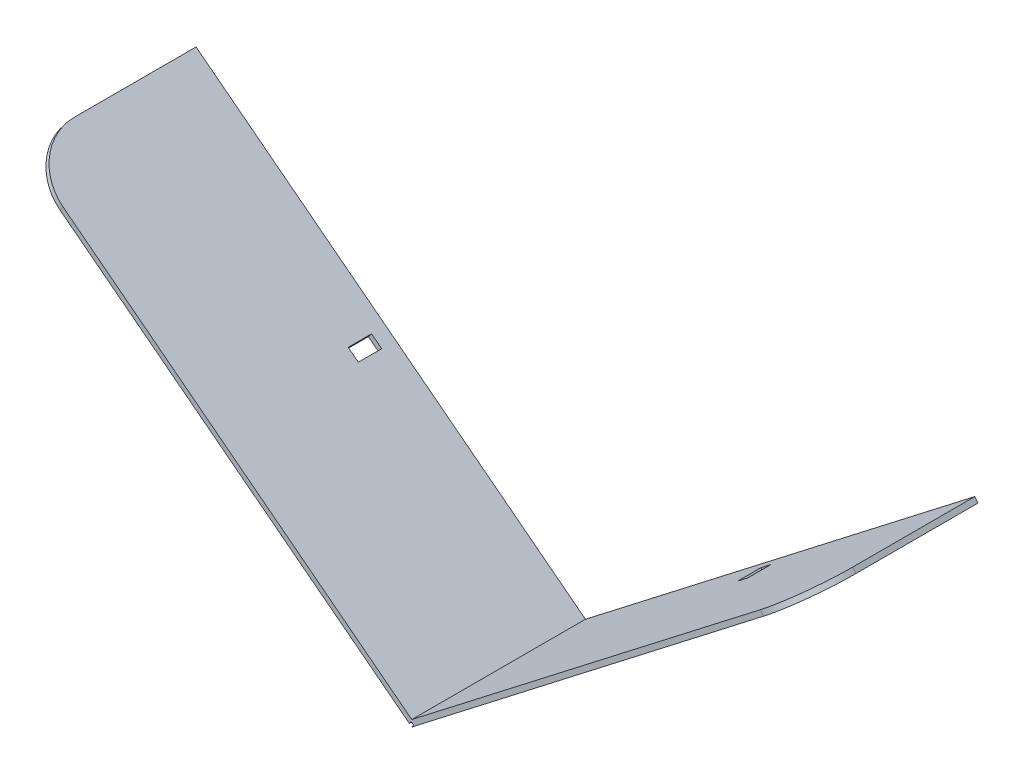
ISO-10303-21;
HEADER;
FILE_DESCRIPTION(('STEP AP214'),'2;1');
FILE_NAME('part.step','',(''),(''),'','','');
FILE_SCHEMA(('AUTOMOTIVE_DESIGN { 1 0 10303 214 1 1 1 1 }'));
ENDSEC;
DATA;
#1=APPLICATION_CONTEXT('core data for automotive mechanical design processes');
#2=APPLICATION_PROTOCOL_DEFINITION('international standard','automotive_design',2000,#1);
#3=PRODUCT_CONTEXT('',#1,'mechanical');
#4=PRODUCT('Part','Part','',(#3));
#5=PRODUCT_RELATED_PRODUCT_CATEGORY('part','',(#4));
#6=PRODUCT_DEFINITION_FORMATION('','',#4);
#7=PRODUCT_DEFINITION_CONTEXT('part definition',#1,'design');
#8=PRODUCT_DEFINITION('design','',#6,#7);
#9=PRODUCT_DEFINITION_SHAPE('','',#8);
#10=(LENGTH_UNIT() NAMED_UNIT(*) SI_UNIT(.MILLI.,.METRE.));
#11=(NAMED_UNIT(*) PLANE_ANGLE_UNIT() SI_UNIT($,.RADIAN.));
#12=(NAMED_UNIT(*) SI_UNIT($,.STERADIAN.) SOLID_ANGLE_UNIT());
#13=UNCERTAINTY_MEASURE_WITH_UNIT(LENGTH_MEASURE(1.E-05),#10,'distance_accuracy_value','');
#14=(GEOMETRIC_REPRESENTATION_CONTEXT(3) GLOBAL_UNCERTAINTY_ASSIGNED_CONTEXT((#13)) GLOBAL_UNIT_ASSIGNED_CONTEXT((#10,
#11,#12)) REPRESENTATION_CONTEXT('',''));
#15=CARTESIAN_POINT('',(0.,0.,0.));
#16=DIRECTION('',(0.,0.,1.));
#17=DIRECTION('',(1.,0.,0.));
#18=AXIS2_PLACEMENT_3D('',#15,#16,#17);
#19=CARTESIAN_POINT('',(0.,0.,-240.2));
#20=DIRECTION('',(-0.611527040185827,-0.791223532967493,0.));
#21=DIRECTION('',(0.791223532967493,-0.611527040185827,0.));
#22=AXIS2_PLACEMENT_3D('',#19,#20,#21);
#23=PLANE('',#22);
#24=DIRECTION('',(0.,0.,1.));
#25=VECTOR('',#24,1.);
#26=CARTESIAN_POINT('',(-186.635563138212,144.248355570605,-240.2));
#27=LINE('',#26,#25);
#28=CARTESIAN_POINT('',(-186.635563138212,144.248355570605,-154.44));
#29=VERTEX_POINT('',#28);
#30=CARTESIAN_POINT('',(-186.635563138212,144.248355570605,-131.84));
#31=VERTEX_POINT('',#30);
#32=EDGE_CURVE('E390',#29,#31,#27,.T.);
#33=ORIENTED_EDGE('',*,*,#32,.F.);
#34=DIRECTION('',(0.791223532967493,-0.611527040185827,0.));
#35=VECTOR('',#34,1.);
#36=CARTESIAN_POINT('',(0.,0.,-154.44));
#37=LINE('',#36,#35);
#38=CARTESIAN_POINT('',(-196.446734947009,151.83129086891,-154.44));
#39=VERTEX_POINT('',#38);
#40=EDGE_CURVE('E376',#39,#29,#37,.T.);
#41=ORIENTED_EDGE('',*,*,#40,.F.);
#42=DIRECTION('',(0.,0.,-1.));
#43=VECTOR('',#42,1.);
#44=CARTESIAN_POINT('',(-196.446734947009,151.83129086891,-240.2));
#45=LINE('',#44,#43);
#46=CARTESIAN_POINT('',(-196.446734947009,151.83129086891,-131.84));
#47=VERTEX_POINT('',#46);
#48=EDGE_CURVE('E385',#47,#39,#45,.T.);
#49=ORIENTED_EDGE('',*,*,#48,.F.);
#50=DIRECTION('',(-0.791223532967493,0.611527040185827,0.));
#51=VECTOR('',#50,1.);
#52=CARTESIAN_POINT('',(0.,0.,-131.84));
#53=LINE('',#52,#51);
#54=EDGE_CURVE('E388',#31,#47,#53,.T.);
#55=ORIENTED_EDGE('',*,*,#54,.F.);
#56=EDGE_LOOP('',(#33,#41,#49,#55));
#57=FACE_BOUND('',#56,.T.);
#58=DIRECTION('',(0.,0.,1.));
#59=VECTOR('',#58,1.);
#60=CARTESIAN_POINT('',(0.,0.,-240.2));
#61=LINE('',#60,#59);
#62=CARTESIAN_POINT('',(0.,0.,-67.256));
#63=VERTEX_POINT('',#62);
#64=CARTESIAN_POINT('',(0.,0.,-33.628));
#65=VERTEX_POINT('',#64);
#66=EDGE_CURVE('E411',#63,#65,#61,.T.);
#67=ORIENTED_EDGE('',*,*,#66,.T.);
#68=DIRECTION('',(-0.791223532967494,0.611527040185827,0.));
#69=VECTOR('',#68,1.);
#70=CARTESIAN_POINT('',(0.,0.,-33.628));
#71=LINE('',#70,#69);
#72=CARTESIAN_POINT('',(-2.37367059890246,1.83458112055752,-33.628));
#73=VERTEX_POINT('',#72);
#74=EDGE_CURVE('E527',#65,#73,#71,.T.);
#75=ORIENTED_EDGE('',*,*,#74,.T.);
#76=DIRECTION('',(0.,0.,-1.));
#77=VECTOR('',#76,1.);
#78=CARTESIAN_POINT('',(-2.37367059890248,1.83458112055744,0.));
#79=LINE('',#78,#77);
#80=CARTESIAN_POINT('',(-2.3736705989025,1.83458112055746,0.));
#81=VERTEX_POINT('',#80);
#82=EDGE_CURVE('E319',#81,#73,#79,.T.);
#83=ORIENTED_EDGE('',*,*,#82,.F.);
#84=DIRECTION('',(0.791223532967493,-0.611527040185827,0.));
#85=VECTOR('',#84,1.);
#86=CARTESIAN_POINT('',(0.,0.,0.));
#87=LINE('',#86,#85);
#88=CARTESIAN_POINT('',(-340.463486235916,263.140085391964,0.));
#89=VERTEX_POINT('',#88);
#90=EDGE_CURVE('E287',#89,#81,#87,.T.);
#91=ORIENTED_EDGE('',*,*,#90,.F.);
#92=CARTESIAN_POINT('',(-340.463486235916,263.140085391964,-50.));
#93=DIRECTION('',(-0.611527040185827,-0.791223532967493,0.));
#94=DIRECTION('',(0.791223532967493,-0.611527040185827,0.));
#95=AXIS2_PLACEMENT_3D('',#92,#93,#94);
#96=CIRCLE('',#95,50.);
#97=CARTESIAN_POINT('',(-380.024662884291,293.716437401255,-50.));
#98=VERTEX_POINT('',#97);
#99=EDGE_CURVE('E460',#89,#98,#96,.T.);
#100=ORIENTED_EDGE('',*,*,#99,.T.);
#101=DIRECTION('',(0.,0.,1.));
#102=VECTOR('',#101,1.);
#103=CARTESIAN_POINT('',(-380.024662884291,293.716437401255,-240.2));
#104=LINE('',#103,#102);
#105=CARTESIAN_POINT('',(-380.024662884291,293.716437401255,-168.14));
#106=VERTEX_POINT('',#105);
#107=EDGE_CURVE('E412',#106,#98,#104,.T.);
#108=ORIENTED_EDGE('',*,*,#107,.F.);
#109=DIRECTION('',(-0.791223532967494,0.611527040185827,0.));
#110=VECTOR('',#109,1.);
#111=CARTESIAN_POINT('',(0.,0.,-168.14));
#112=LINE('',#111,#110);
#113=CARTESIAN_POINT('',(-2.37367059890247,1.83458112055746,-168.14));
#114=VERTEX_POINT('',#113);
#115=EDGE_CURVE('E400',#114,#106,#112,.T.);
#116=ORIENTED_EDGE('',*,*,#115,.F.);
#117=DIRECTION('',(0.,0.,-1.));
#118=VECTOR('',#117,1.);
#119=CARTESIAN_POINT('',(-2.37367059890249,1.83458112055745,0.));
#120=LINE('',#119,#118);
#121=CARTESIAN_POINT('',(-2.37367059890241,1.83458112055751,-134.512));
#122=VERTEX_POINT('',#121);
#123=EDGE_CURVE('E329',#122,#114,#120,.T.);
#124=ORIENTED_EDGE('',*,*,#123,.F.);
#125=DIRECTION('',(-0.791223532967494,0.611527040185827,0.));
#126=VECTOR('',#125,1.);
#127=CARTESIAN_POINT('',(0.,0.,-134.512));
#128=LINE('',#127,#126);
#129=CARTESIAN_POINT('',(0.,0.,-134.512));
#130=VERTEX_POINT('',#129);
#131=EDGE_CURVE('E337',#130,#122,#128,.T.);
#132=ORIENTED_EDGE('',*,*,#131,.F.);
#133=CARTESIAN_POINT('',(0.,0.,-100.884));
#134=VERTEX_POINT('',#133);
#135=EDGE_CURVE('E431',#130,#134,#61,.T.);
#136=ORIENTED_EDGE('',*,*,#135,.T.);
#137=DIRECTION('',(-0.791223532967494,0.611527040185827,0.));
#138=VECTOR('',#137,1.);
#139=CARTESIAN_POINT('',(0.,0.,-100.884));
#140=LINE('',#139,#138);
#141=CARTESIAN_POINT('',(-2.37367059890248,1.83458112055746,-100.884));
#142=VERTEX_POINT('',#141);
#143=EDGE_CURVE('E312',#134,#142,#140,.T.);
#144=ORIENTED_EDGE('',*,*,#143,.T.);
#145=DIRECTION('',(0.,0.,-1.));
#146=VECTOR('',#145,1.);
#147=CARTESIAN_POINT('',(-2.37367059890248,1.83458112055745,0.));
#148=LINE('',#147,#146);
#149=CARTESIAN_POINT('',(-2.37367059890246,1.83458112055746,-67.256));
#150=VERTEX_POINT('',#149);
#151=EDGE_CURVE('E308',#150,#142,#148,.T.);
#152=ORIENTED_EDGE('',*,*,#151,.F.);
#153=DIRECTION('',(-0.791223532967494,0.611527040185827,0.));
#154=VECTOR('',#153,1.);
#155=CARTESIAN_POINT('',(0.,0.,-67.256));
#156=LINE('',#155,#154);
#157=EDGE_CURVE('E102',#63,#150,#156,.T.);
#158=ORIENTED_EDGE('',*,*,#157,.F.);
#159=EDGE_LOOP('',(#67,#75,#83,#91,#100,#108,#116,#124,#132,#136,#144,#152,#158));
#160=FACE_BOUND('',#159,.T.);
#161=ADVANCED_FACE('F87',(#57,#160),#23,.T.);
#162=CARTESIAN_POINT('',(0.,6.31932670309673,-240.2));
#163=DIRECTION('',(-0.611527040185833,0.791223532967489,0.));
#164=DIRECTION('',(-0.791223532967489,-0.611527040185833,0.));
#165=AXIS2_PLACEMENT_3D('',#162,#163,#164);
#166=PLANE('',#165);
#167=DIRECTION('',(-0.791223532967489,-0.611527040185833,0.));
#168=VECTOR('',#167,1.);
#169=CARTESIAN_POINT('',(0.,6.31932670309673,0.));
#170=LINE('',#169,#168);
#171=CARTESIAN_POINT('',(337.405851034982,267.096203056801,0.));
#172=VERTEX_POINT('',#171);
#173=CARTESIAN_POINT('',(0.,6.31932670309673,0.));
#174=VERTEX_POINT('',#173);
#175=EDGE_CURVE('E406',#172,#174,#170,.T.);
#176=ORIENTED_EDGE('',*,*,#175,.F.);
#177=CARTESIAN_POINT('',(337.405851034981,267.096203056801,-50.));
#178=DIRECTION('',(-0.611527040185833,0.791223532967489,0.));
#179=DIRECTION('',(-0.791223532967489,-0.611527040185833,0.));
#180=AXIS2_PLACEMENT_3D('',#177,#178,#179);
#181=CIRCLE('',#180,50.);
#182=CARTESIAN_POINT('',(376.967027683356,297.672555066093,-50.));
#183=VERTEX_POINT('',#182);
#184=EDGE_CURVE('E466',#172,#183,#181,.T.);
#185=ORIENTED_EDGE('',*,*,#184,.T.);
#186=DIRECTION('',(0.,0.,1.));
#187=VECTOR('',#186,1.);
#188=CARTESIAN_POINT('',(376.967027683356,297.672555066093,-240.2));
#189=LINE('',#188,#187);
#190=CARTESIAN_POINT('',(376.967027683356,297.672555066093,-168.14));
#191=VERTEX_POINT('',#190);
#192=EDGE_CURVE('E422',#191,#183,#189,.T.);
#193=ORIENTED_EDGE('',*,*,#192,.F.);
#194=DIRECTION('',(0.791223532967489,0.611527040185833,0.));
#195=VECTOR('',#194,1.);
#196=CARTESIAN_POINT('',(0.,6.31932670309673,-168.14));
#197=LINE('',#196,#195);
#198=CARTESIAN_POINT('',(0.,6.31932670309673,-168.14));
#199=VERTEX_POINT('',#198);
#200=EDGE_CURVE('E394',#199,#191,#197,.T.);
#201=ORIENTED_EDGE('',*,*,#200,.F.);
#202=DIRECTION('',(0.,0.,1.));
#203=VECTOR('',#202,1.);
#204=CARTESIAN_POINT('',(0.,6.31932670309673,-240.2));
#205=LINE('',#204,#203);
#206=EDGE_CURVE('E419',#199,#174,#205,.T.);
#207=ORIENTED_EDGE('',*,*,#206,.T.);
#208=EDGE_LOOP('',(#176,#185,#193,#201,#207));
#209=FACE_BOUND('',#208,.T.);
#210=DIRECTION('',(-0.791223532967489,-0.611527040185833,0.));
#211=VECTOR('',#210,1.);
#212=CARTESIAN_POINT('',(0.,6.31932670309673,-131.84));
#213=LINE('',#212,#211);
#214=CARTESIAN_POINT('',(193.389099746078,155.787408533749,-131.84));
#215=VERTEX_POINT('',#214);
#216=CARTESIAN_POINT('',(183.577927937281,148.204473235444,-131.84));
#217=VERTEX_POINT('',#216);
#218=EDGE_CURVE('E351',#215,#217,#213,.T.);
#219=ORIENTED_EDGE('',*,*,#218,.T.);
#220=DIRECTION('',(0.,0.,-1.));
#221=VECTOR('',#220,1.);
#222=CARTESIAN_POINT('',(183.577927937281,148.204473235444,-240.2));
#223=LINE('',#222,#221);
#224=CARTESIAN_POINT('',(183.577927937281,148.204473235444,-154.44));
#225=VERTEX_POINT('',#224);
#226=EDGE_CURVE('E369',#217,#225,#223,.T.);
#227=ORIENTED_EDGE('',*,*,#226,.T.);
#228=DIRECTION('',(0.791223532967489,0.611527040185833,0.));
#229=VECTOR('',#228,1.);
#230=CARTESIAN_POINT('',(0.,6.31932670309673,-154.44));
#231=LINE('',#230,#229);
#232=CARTESIAN_POINT('',(193.389099746078,155.787408533749,-154.44));
#233=VERTEX_POINT('',#232);
#234=EDGE_CURVE('E366',#225,#233,#231,.T.);
#235=ORIENTED_EDGE('',*,*,#234,.T.);
#236=DIRECTION('',(0.,0.,1.));
#237=VECTOR('',#236,1.);
#238=CARTESIAN_POINT('',(193.389099746078,155.787408533749,-240.2));
#239=LINE('',#238,#237);
#240=EDGE_CURVE('E363',#233,#215,#239,.T.);
#241=ORIENTED_EDGE('',*,*,#240,.T.);
#242=EDGE_LOOP('',(#219,#227,#235,#241));
#243=FACE_BOUND('',#242,.T.);
#244=ADVANCED_FACE('F484',(#209,#243),#166,.T.);
#245=CARTESIAN_POINT('',(0.,0.,-240.2));
#246=DIRECTION('',(0.611527040185833,-0.791223532967489,0.));
#247=DIRECTION('',(0.791223532967489,0.611527040185833,0.));
#248=AXIS2_PLACEMENT_3D('',#245,#246,#247);
#249=PLANE('',#248);
#250=DIRECTION('',(0.,0.,1.));
#251=VECTOR('',#250,1.);
#252=CARTESIAN_POINT('',(380.024662884285,293.716437401255,-240.2));
#253=LINE('',#252,#251);
#254=CARTESIAN_POINT('',(380.024662884285,293.716437401255,-168.14));
#255=VERTEX_POINT('',#254);
#256=CARTESIAN_POINT('',(380.024662884285,293.716437401255,-50.));
#257=VERTEX_POINT('',#256);
#258=EDGE_CURVE('E425',#255,#257,#253,.T.);
#259=ORIENTED_EDGE('',*,*,#258,.T.);
#260=CARTESIAN_POINT('',(340.463486235911,263.140085391964,-50.));
#261=DIRECTION('',(0.611527040185833,-0.791223532967489,0.));
#262=DIRECTION('',(0.791223532967489,0.611527040185833,0.));
#263=AXIS2_PLACEMENT_3D('',#260,#261,#262);
#264=CIRCLE('',#263,50.);
#265=CARTESIAN_POINT('',(340.463486235911,263.140085391964,0.));
#266=VERTEX_POINT('',#265);
#267=EDGE_CURVE('E12',#257,#266,#264,.T.);
#268=ORIENTED_EDGE('',*,*,#267,.T.);
#269=DIRECTION('',(0.791223532967489,0.611527040185833,0.));
#270=VECTOR('',#269,1.);
#271=CARTESIAN_POINT('',(0.,0.,0.));
#272=LINE('',#271,#270);
#273=CARTESIAN_POINT('',(0.,0.,0.));
#274=VERTEX_POINT('',#273);
#275=EDGE_CURVE('E403',#274,#266,#272,.T.);
#276=ORIENTED_EDGE('',*,*,#275,.F.);
#277=DIRECTION('',(0.,0.,1.));
#278=VECTOR('',#277,1.);
#279=CARTESIAN_POINT('',(0.,0.,0.));
#280=LINE('',#279,#278);
#281=EDGE_CURVE('E281',#65,#274,#280,.T.);
#282=ORIENTED_EDGE('',*,*,#281,.F.);
#283=ORIENTED_EDGE('',*,*,#66,.F.);
#284=DIRECTION('',(0.,0.,1.));
#285=VECTOR('',#284,1.);
#286=CARTESIAN_POINT('',(0.,0.,0.));
#287=LINE('',#286,#285);
#288=EDGE_CURVE('E298',#134,#63,#287,.T.);
#289=ORIENTED_EDGE('',*,*,#288,.F.);
#290=ORIENTED_EDGE('',*,*,#135,.F.);
#291=CARTESIAN_POINT('',(0.,0.,-168.14));
#292=VERTEX_POINT('',#291);
#293=EDGE_CURVE('E428',#292,#130,#61,.T.);
#294=ORIENTED_EDGE('',*,*,#293,.F.);
#295=DIRECTION('',(-0.791223532967489,-0.611527040185833,0.));
#296=VECTOR('',#295,1.);
#297=CARTESIAN_POINT('',(0.,0.,-168.14));
#298=LINE('',#297,#296);
#299=EDGE_CURVE('E415',#255,#292,#298,.T.);
#300=ORIENTED_EDGE('',*,*,#299,.F.);
#301=EDGE_LOOP('',(#259,#268,#276,#282,#283,#289,#290,#294,#300));
#302=FACE_BOUND('',#301,.T.);
#303=DIRECTION('',(-0.791223532967489,-0.611527040185833,0.));
#304=VECTOR('',#303,1.);
#305=CARTESIAN_POINT('',(0.,0.,-154.44));
#306=LINE('',#305,#304);
#307=CARTESIAN_POINT('',(196.446734947007,151.831290868911,-154.44));
#308=VERTEX_POINT('',#307);
#309=CARTESIAN_POINT('',(186.635563138211,144.248355570607,-154.44));
#310=VERTEX_POINT('',#309);
#311=EDGE_CURVE('E449',#308,#310,#306,.T.);
#312=ORIENTED_EDGE('',*,*,#311,.T.);
#313=DIRECTION('',(0.,0.,1.));
#314=VECTOR('',#313,1.);
#315=CARTESIAN_POINT('',(186.635563138211,144.248355570607,-240.2));
#316=LINE('',#315,#314);
#317=CARTESIAN_POINT('',(186.635563138211,144.248355570607,-131.84));
#318=VERTEX_POINT('',#317);
#319=EDGE_CURVE('E452',#310,#318,#316,.T.);
#320=ORIENTED_EDGE('',*,*,#319,.T.);
#321=DIRECTION('',(0.791223532967489,0.611527040185833,0.));
#322=VECTOR('',#321,1.);
#323=CARTESIAN_POINT('',(0.,0.,-131.84));
#324=LINE('',#323,#322);
#325=CARTESIAN_POINT('',(196.446734947007,151.831290868911,-131.84));
#326=VERTEX_POINT('',#325);
#327=EDGE_CURVE('E443',#318,#326,#324,.T.);
#328=ORIENTED_EDGE('',*,*,#327,.T.);
#329=DIRECTION('',(0.,0.,-1.));
#330=VECTOR('',#329,1.);
#331=CARTESIAN_POINT('',(196.446734947007,151.831290868911,-240.2));
#332=LINE('',#331,#330);
#333=EDGE_CURVE('E446',#326,#308,#332,.T.);
#334=ORIENTED_EDGE('',*,*,#333,.T.);
#335=EDGE_LOOP('',(#312,#320,#328,#334));
#336=FACE_BOUND('',#335,.T.);
#337=ADVANCED_FACE('F477',(#302,#336),#249,.T.);
#338=CARTESIAN_POINT('',(-380.024662884291,293.716437401255,-240.2));
#339=DIRECTION('',(-0.791223532967494,0.611527040185826,0.));
#340=DIRECTION('',(-0.611527040185826,-0.791223532967494,0.));
#341=AXIS2_PLACEMENT_3D('',#338,#339,#340);
#342=PLANE('',#341);
#343=ORIENTED_EDGE('',*,*,#107,.T.);
#344=DIRECTION('',(-0.611527040185826,-0.791223532967494,0.));
#345=VECTOR('',#344,1.);
#346=CARTESIAN_POINT('',(-376.967027683362,297.672555066093,-50.));
#347=LINE('',#346,#345);
#348=CARTESIAN_POINT('',(-376.967027683362,297.672555066093,-50.));
#349=VERTEX_POINT('',#348);
#350=EDGE_CURVE('E462',#98,#349,#347,.F.);
#351=ORIENTED_EDGE('',*,*,#350,.T.);
#352=DIRECTION('',(0.,0.,1.));
#353=VECTOR('',#352,1.);
#354=CARTESIAN_POINT('',(-376.967027683362,297.672555066093,-240.2));
#355=LINE('',#354,#353);
#356=CARTESIAN_POINT('',(-376.967027683362,297.672555066093,-168.14));
#357=VERTEX_POINT('',#356);
#358=EDGE_CURVE('E416',#357,#349,#355,.T.);
#359=ORIENTED_EDGE('',*,*,#358,.F.);
#360=DIRECTION('',(0.611527040185826,0.791223532967494,0.));
#361=VECTOR('',#360,1.);
#362=CARTESIAN_POINT('',(-380.024662884291,293.716437401255,-168.14));
#363=LINE('',#362,#361);
#364=EDGE_CURVE('E398',#106,#357,#363,.T.);
#365=ORIENTED_EDGE('',*,*,#364,.F.);
#366=EDGE_LOOP('',(#343,#351,#359,#365));
#367=FACE_BOUND('',#366,.T.);
#368=ADVANCED_FACE('F503',(#367),#342,.T.);
#369=CARTESIAN_POINT('',(0.,6.31932670309673,-240.2));
#370=DIRECTION('',(0.611527040185827,0.791223532967494,0.));
#371=DIRECTION('',(-0.791223532967494,0.611527040185827,0.));
#372=AXIS2_PLACEMENT_3D('',#369,#370,#371);
#373=PLANE('',#372);
#374=DIRECTION('',(0.,0.,-1.));
#375=VECTOR('',#374,1.);
#376=CARTESIAN_POINT('',(-183.577927937283,148.204473235443,-240.2));
#377=LINE('',#376,#375);
#378=CARTESIAN_POINT('',(-183.577927937283,148.204473235443,-131.84));
#379=VERTEX_POINT('',#378);
#380=CARTESIAN_POINT('',(-183.577927937283,148.204473235443,-154.44));
#381=VERTEX_POINT('',#380);
#382=EDGE_CURVE('E440',#379,#381,#377,.T.);
#383=ORIENTED_EDGE('',*,*,#382,.F.);
#384=DIRECTION('',(0.791223532967494,-0.611527040185827,0.));
#385=VECTOR('',#384,1.);
#386=CARTESIAN_POINT('',(0.,6.31932670309673,-131.84));
#387=LINE('',#386,#385);
#388=CARTESIAN_POINT('',(-193.389099746079,155.787408533747,-131.84));
#389=VERTEX_POINT('',#388);
#390=EDGE_CURVE('E438',#389,#379,#387,.T.);
#391=ORIENTED_EDGE('',*,*,#390,.F.);
#392=DIRECTION('',(0.,0.,1.));
#393=VECTOR('',#392,1.);
#394=CARTESIAN_POINT('',(-193.389099746079,155.787408533747,-240.2));
#395=LINE('',#394,#393);
#396=CARTESIAN_POINT('',(-193.389099746079,155.787408533747,-154.44));
#397=VERTEX_POINT('',#396);
#398=EDGE_CURVE('E436',#397,#389,#395,.T.);
#399=ORIENTED_EDGE('',*,*,#398,.F.);
#400=DIRECTION('',(-0.791223532967494,0.611527040185827,0.));
#401=VECTOR('',#400,1.);
#402=CARTESIAN_POINT('',(0.,6.31932670309673,-154.44));
#403=LINE('',#402,#401);
#404=EDGE_CURVE('E434',#381,#397,#403,.T.);
#405=ORIENTED_EDGE('',*,*,#404,.F.);
#406=EDGE_LOOP('',(#383,#391,#399,#405));
#407=FACE_BOUND('',#406,.T.);
#408=ORIENTED_EDGE('',*,*,#358,.T.);
#409=CARTESIAN_POINT('',(-337.405851034987,267.096203056802,-50.));
#410=DIRECTION('',(0.611527040185827,0.791223532967494,0.));
#411=DIRECTION('',(-0.791223532967494,0.611527040185827,0.));
#412=AXIS2_PLACEMENT_3D('',#409,#410,#411);
#413=CIRCLE('',#412,50.);
#414=CARTESIAN_POINT('',(-337.405851034987,267.096203056802,0.));
#415=VERTEX_POINT('',#414);
#416=EDGE_CURVE('E464',#349,#415,#413,.T.);
#417=ORIENTED_EDGE('',*,*,#416,.T.);
#418=DIRECTION('',(-0.791223532967493,0.611527040185827,0.));
#419=VECTOR('',#418,1.);
#420=CARTESIAN_POINT('',(0.,6.31932670309673,0.));
#421=LINE('',#420,#419);
#422=EDGE_CURVE('E408',#174,#415,#421,.T.);
#423=ORIENTED_EDGE('',*,*,#422,.F.);
#424=ORIENTED_EDGE('',*,*,#206,.F.);
#425=DIRECTION('',(0.791223532967494,-0.611527040185827,0.));
#426=VECTOR('',#425,1.);
#427=CARTESIAN_POINT('',(0.,6.31932670309672,-168.14));
#428=LINE('',#427,#426);
#429=EDGE_CURVE('E396',#357,#199,#428,.T.);
#430=ORIENTED_EDGE('',*,*,#429,.F.);
#431=EDGE_LOOP('',(#408,#417,#423,#424,#430));
#432=FACE_BOUND('',#431,.T.);
#433=ADVANCED_FACE('F491',(#407,#432),#373,.T.);
#434=CARTESIAN_POINT('',(380.024662884285,293.716437401255,-240.2));
#435=DIRECTION('',(0.791223532967503,0.611527040185814,0.));
#436=DIRECTION('',(-0.611527040185814,0.791223532967504,0.));
#437=AXIS2_PLACEMENT_3D('',#434,#435,#436);
#438=PLANE('',#437);
#439=ORIENTED_EDGE('',*,*,#192,.T.);
#440=DIRECTION('',(-0.611527040185814,0.791223532967504,0.));
#441=VECTOR('',#440,1.);
#442=CARTESIAN_POINT('',(380.024662884285,293.716437401255,-50.));
#443=LINE('',#442,#441);
#444=EDGE_CURVE('E95',#183,#257,#443,.F.);
#445=ORIENTED_EDGE('',*,*,#444,.T.);
#446=ORIENTED_EDGE('',*,*,#258,.F.);
#447=DIRECTION('',(0.611527040185814,-0.791223532967504,0.));
#448=VECTOR('',#447,1.);
#449=CARTESIAN_POINT('',(380.024662884285,293.716437401255,-168.14));
#450=LINE('',#449,#448);
#451=EDGE_CURVE('E392',#191,#255,#450,.T.);
#452=ORIENTED_EDGE('',*,*,#451,.F.);
#453=EDGE_LOOP('',(#439,#445,#446,#452));
#454=FACE_BOUND('',#453,.T.);
#455=ADVANCED_FACE('F470',(#454),#438,.T.);
#456=CARTESIAN_POINT('',(0.,0.,0.));
#457=DIRECTION('',(0.,0.,-1.));
#458=DIRECTION('',(-1.,0.,0.));
#459=AXIS2_PLACEMENT_3D('',#456,#457,#458);
#460=PLANE('',#459);
#461=DIRECTION('',(-0.791223532967494,0.611527040185827,0.));
#462=VECTOR('',#461,1.);
#463=CARTESIAN_POINT('',(1.83458112055746,2.37367059890246,0.));
#464=LINE('',#463,#462);
#465=CARTESIAN_POINT('',(1.83458112055747,2.37367059890246,0.));
#466=VERTEX_POINT('',#465);
#467=CARTESIAN_POINT('',(-0.539089478345022,4.20825171945995,0.));
#468=VERTEX_POINT('',#467);
#469=EDGE_CURVE('E275',#466,#468,#464,.T.);
#470=ORIENTED_EDGE('',*,*,#469,.F.);
#471=DIRECTION('',(-0.611527040185827,-0.791223532967493,0.));
#472=VECTOR('',#471,1.);
#473=CARTESIAN_POINT('',(1.83458112055746,2.37367059890246,0.));
#474=LINE('',#473,#472);
#475=EDGE_CURVE('E360',#466,#274,#474,.T.);
#476=ORIENTED_EDGE('',*,*,#475,.T.);
#477=ORIENTED_EDGE('',*,*,#275,.T.);
#478=DIRECTION('',(-0.611527040185814,0.791223532967504,0.));
#479=VECTOR('',#478,1.);
#480=CARTESIAN_POINT('',(337.405851034981,267.096203056802,0.));
#481=LINE('',#480,#479);
#482=EDGE_CURVE('E455',#266,#172,#481,.T.);
#483=ORIENTED_EDGE('',*,*,#482,.T.);
#484=ORIENTED_EDGE('',*,*,#175,.T.);
#485=ORIENTED_EDGE('',*,*,#422,.T.);
#486=DIRECTION('',(-0.611527040185826,-0.791223532967494,0.));
#487=VECTOR('',#486,1.);
#488=CARTESIAN_POINT('',(-340.463486235916,263.140085391964,0.));
#489=LINE('',#488,#487);
#490=EDGE_CURVE('E458',#415,#89,#489,.T.);
#491=ORIENTED_EDGE('',*,*,#490,.T.);
#492=ORIENTED_EDGE('',*,*,#90,.T.);
#493=DIRECTION('',(-0.611527040185827,-0.791223532967493,0.));
#494=VECTOR('',#493,1.);
#495=CARTESIAN_POINT('',(-0.539089478345022,4.20825171945995,0.));
#496=LINE('',#495,#494);
#497=EDGE_CURVE('E271',#468,#81,#496,.T.);
#498=ORIENTED_EDGE('',*,*,#497,.F.);
#499=EDGE_LOOP('',(#470,#476,#477,#483,#484,#485,#491,#492,#498));
#500=FACE_BOUND('',#499,.T.);
#501=ADVANCED_FACE('F284',(#500),#460,.F.);
#502=CARTESIAN_POINT('',(0.,297.672555066093,-168.14));
#503=DIRECTION('',(0.,0.,1.));
#504=DIRECTION('',(1.,0.,0.));
#505=AXIS2_PLACEMENT_3D('',#502,#503,#504);
#506=PLANE('',#505);
#507=ORIENTED_EDGE('',*,*,#299,.T.);
#508=DIRECTION('',(-0.611527040185827,-0.791223532967493,0.));
#509=VECTOR('',#508,1.);
#510=CARTESIAN_POINT('',(1.83458112055748,2.37367059890248,-168.14));
#511=LINE('',#510,#509);
#512=CARTESIAN_POINT('',(1.83458112055748,2.37367059890248,-168.14));
#513=VERTEX_POINT('',#512);
#514=EDGE_CURVE('E342',#513,#292,#511,.T.);
#515=ORIENTED_EDGE('',*,*,#514,.F.);
#516=DIRECTION('',(0.791223532967494,-0.611527040185827,0.));
#517=VECTOR('',#516,1.);
#518=CARTESIAN_POINT('',(1.83458112055746,2.37367059890249,-168.14));
#519=LINE('',#518,#517);
#520=CARTESIAN_POINT('',(-0.539089478344995,4.20825171945999,-168.14));
#521=VERTEX_POINT('',#520);
#522=EDGE_CURVE('E331',#521,#513,#519,.T.);
#523=ORIENTED_EDGE('',*,*,#522,.F.);
#524=DIRECTION('',(-0.611527040185827,-0.791223532967493,0.));
#525=VECTOR('',#524,1.);
#526=CARTESIAN_POINT('',(-0.539089478344991,4.20825171945994,-168.14));
#527=LINE('',#526,#525);
#528=EDGE_CURVE('E344',#521,#114,#527,.T.);
#529=ORIENTED_EDGE('',*,*,#528,.T.);
#530=ORIENTED_EDGE('',*,*,#115,.T.);
#531=ORIENTED_EDGE('',*,*,#364,.T.);
#532=ORIENTED_EDGE('',*,*,#429,.T.);
#533=ORIENTED_EDGE('',*,*,#200,.T.);
#534=ORIENTED_EDGE('',*,*,#451,.T.);
#535=EDGE_LOOP('',(#507,#515,#523,#529,#530,#531,#532,#533,#534));
#536=FACE_BOUND('',#535,.T.);
#537=ADVANCED_FACE('F506',(#536),#506,.F.);
#538=CARTESIAN_POINT('',(-328.751608135456,-39.6283200706181,-131.84));
#539=DIRECTION('',(0.791223532967493,-0.611527040185827,0.));
#540=DIRECTION('',(0.611527040185827,0.791223532967493,0.));
#541=AXIS2_PLACEMENT_3D('',#538,#539,#540);
#542=PLANE('',#541);
#543=ORIENTED_EDGE('',*,*,#32,.T.);
#544=DIRECTION('',(0.611527040185827,0.791223532967493,0.));
#545=VECTOR('',#544,1.);
#546=CARTESIAN_POINT('',(-328.751608135456,-39.6283200706181,-131.84));
#547=LINE('',#546,#545);
#548=EDGE_CURVE('E373',#31,#379,#547,.T.);
#549=ORIENTED_EDGE('',*,*,#548,.T.);
#550=ORIENTED_EDGE('',*,*,#382,.T.);
#551=DIRECTION('',(0.611527040185827,0.791223532967493,0.));
#552=VECTOR('',#551,1.);
#553=CARTESIAN_POINT('',(-328.751608135456,-39.6283200706181,-154.44));
#554=LINE('',#553,#552);
#555=EDGE_CURVE('E372',#29,#381,#554,.T.);
#556=ORIENTED_EDGE('',*,*,#555,.F.);
#557=EDGE_LOOP('',(#543,#549,#550,#556));
#558=FACE_BOUND('',#557,.T.);
#559=ADVANCED_FACE('F584',(#558),#542,.F.);
#560=CARTESIAN_POINT('',(-338.562779944253,-32.0453847723139,-131.84));
#561=DIRECTION('',(0.,0.,1.));
#562=DIRECTION('',(1.,0.,0.));
#563=AXIS2_PLACEMENT_3D('',#560,#561,#562);
#564=PLANE('',#563);
#565=ORIENTED_EDGE('',*,*,#54,.T.);
#566=DIRECTION('',(0.611527040185827,0.791223532967493,0.));
#567=VECTOR('',#566,1.);
#568=CARTESIAN_POINT('',(-338.562779944253,-32.0453847723139,-131.84));
#569=LINE('',#568,#567);
#570=EDGE_CURVE('E377',#47,#389,#569,.T.);
#571=ORIENTED_EDGE('',*,*,#570,.T.);
#572=ORIENTED_EDGE('',*,*,#390,.T.);
#573=ORIENTED_EDGE('',*,*,#548,.F.);
#574=EDGE_LOOP('',(#565,#571,#572,#573));
#575=FACE_BOUND('',#574,.T.);
#576=ADVANCED_FACE('F580',(#575),#564,.F.);
#577=CARTESIAN_POINT('',(-338.562779944253,-32.0453847723139,-131.84));
#578=DIRECTION('',(-0.791223532967493,0.611527040185827,0.));
#579=DIRECTION('',(-0.611527040185827,-0.791223532967493,0.));
#580=AXIS2_PLACEMENT_3D('',#577,#578,#579);
#581=PLANE('',#580);
#582=ORIENTED_EDGE('',*,*,#48,.T.);
#583=DIRECTION('',(0.611527040185827,0.791223532967493,0.));
#584=VECTOR('',#583,1.);
#585=CARTESIAN_POINT('',(-338.562779944253,-32.0453847723139,-154.44));
#586=LINE('',#585,#584);
#587=EDGE_CURVE('E380',#39,#397,#586,.T.);
#588=ORIENTED_EDGE('',*,*,#587,.T.);
#589=ORIENTED_EDGE('',*,*,#398,.T.);
#590=ORIENTED_EDGE('',*,*,#570,.F.);
#591=EDGE_LOOP('',(#582,#588,#589,#590));
#592=FACE_BOUND('',#591,.T.);
#593=ADVANCED_FACE('F583',(#592),#581,.F.);
#594=CARTESIAN_POINT('',(-338.562779944253,-32.0453847723139,-154.44));
#595=DIRECTION('',(0.,0.,-1.));
#596=DIRECTION('',(-1.,0.,0.));
#597=AXIS2_PLACEMENT_3D('',#594,#595,#596);
#598=PLANE('',#597);
#599=ORIENTED_EDGE('',*,*,#40,.T.);
#600=ORIENTED_EDGE('',*,*,#555,.T.);
#601=ORIENTED_EDGE('',*,*,#404,.T.);
#602=ORIENTED_EDGE('',*,*,#587,.F.);
#603=EDGE_LOOP('',(#599,#600,#601,#602));
#604=FACE_BOUND('',#603,.T.);
#605=ADVANCED_FACE('F578',(#604),#598,.F.);
#606=CARTESIAN_POINT('',(328.751608135453,-39.6283200706153,-131.84));
#607=DIRECTION('',(0.791223532967493,0.611527040185827,0.));
#608=DIRECTION('',(-0.611527040185827,0.791223532967493,0.));
#609=AXIS2_PLACEMENT_3D('',#606,#607,#608);
#610=PLANE('',#609);
#611=DIRECTION('',(-0.611527040185827,0.791223532967493,0.));
#612=VECTOR('',#611,1.);
#613=CARTESIAN_POINT('',(328.751608135453,-39.6283200706153,-131.84));
#614=LINE('',#613,#612);
#615=EDGE_CURVE('E358',#318,#217,#614,.T.);
#616=ORIENTED_EDGE('',*,*,#615,.F.);
#617=ORIENTED_EDGE('',*,*,#319,.F.);
#618=DIRECTION('',(-0.611527040185827,0.791223532967493,0.));
#619=VECTOR('',#618,1.);
#620=CARTESIAN_POINT('',(328.751608135453,-39.6283200706153,-154.44));
#621=LINE('',#620,#619);
#622=EDGE_CURVE('E348',#310,#225,#621,.T.);
#623=ORIENTED_EDGE('',*,*,#622,.T.);
#624=ORIENTED_EDGE('',*,*,#226,.F.);
#625=EDGE_LOOP('',(#616,#617,#623,#624));
#626=FACE_BOUND('',#625,.T.);
#627=ADVANCED_FACE('F575',(#626),#610,.T.);
#628=CARTESIAN_POINT('',(338.56277994425,-32.0453847723111,-154.44));
#629=DIRECTION('',(0.,0.,1.));
#630=DIRECTION('',(1.,0.,0.));
#631=AXIS2_PLACEMENT_3D('',#628,#629,#630);
#632=PLANE('',#631);
#633=ORIENTED_EDGE('',*,*,#622,.F.);
#634=ORIENTED_EDGE('',*,*,#311,.F.);
#635=DIRECTION('',(-0.611527040185827,0.791223532967493,0.));
#636=VECTOR('',#635,1.);
#637=CARTESIAN_POINT('',(338.56277994425,-32.0453847723111,-154.44));
#638=LINE('',#637,#636);
#639=EDGE_CURVE('E352',#308,#233,#638,.T.);
#640=ORIENTED_EDGE('',*,*,#639,.T.);
#641=ORIENTED_EDGE('',*,*,#234,.F.);
#642=EDGE_LOOP('',(#633,#634,#640,#641));
#643=FACE_BOUND('',#642,.T.);
#644=ADVANCED_FACE('F570',(#643),#632,.T.);
#645=CARTESIAN_POINT('',(338.56277994425,-32.0453847723111,-131.84));
#646=DIRECTION('',(-0.791223532967493,-0.611527040185827,0.));
#647=DIRECTION('',(0.611527040185827,-0.791223532967493,0.));
#648=AXIS2_PLACEMENT_3D('',#645,#646,#647);
#649=PLANE('',#648);
#650=ORIENTED_EDGE('',*,*,#639,.F.);
#651=ORIENTED_EDGE('',*,*,#333,.F.);
#652=DIRECTION('',(-0.611527040185827,0.791223532967493,0.));
#653=VECTOR('',#652,1.);
#654=CARTESIAN_POINT('',(338.56277994425,-32.0453847723111,-131.84));
#655=LINE('',#654,#653);
#656=EDGE_CURVE('E355',#326,#215,#655,.T.);
#657=ORIENTED_EDGE('',*,*,#656,.T.);
#658=ORIENTED_EDGE('',*,*,#240,.F.);
#659=EDGE_LOOP('',(#650,#651,#657,#658));
#660=FACE_BOUND('',#659,.T.);
#661=ADVANCED_FACE('F564',(#660),#649,.T.);
#662=CARTESIAN_POINT('',(338.56277994425,-32.0453847723111,-131.84));
#663=DIRECTION('',(0.,0.,-1.));
#664=DIRECTION('',(-1.,0.,0.));
#665=AXIS2_PLACEMENT_3D('',#662,#663,#664);
#666=PLANE('',#665);
#667=ORIENTED_EDGE('',*,*,#656,.F.);
#668=ORIENTED_EDGE('',*,*,#327,.F.);
#669=ORIENTED_EDGE('',*,*,#615,.T.);
#670=ORIENTED_EDGE('',*,*,#218,.F.);
#671=EDGE_LOOP('',(#667,#668,#669,#670));
#672=FACE_BOUND('',#671,.T.);
#673=ADVANCED_FACE('F559',(#672),#666,.T.);
#674=CARTESIAN_POINT('',(-340.463486235916,263.140085391964,-50.));
#675=DIRECTION('',(0.611527040185826,0.791223532967494,0.));
#676=DIRECTION('',(-0.791223532967494,0.611527040185826,0.));
#677=AXIS2_PLACEMENT_3D('',#674,#675,#676);
#678=CYLINDRICAL_SURFACE('',#677,50.);
#679=ORIENTED_EDGE('',*,*,#416,.F.);
#680=ORIENTED_EDGE('',*,*,#350,.F.);
#681=ORIENTED_EDGE('',*,*,#99,.F.);
#682=ORIENTED_EDGE('',*,*,#490,.F.);
#683=EDGE_LOOP('',(#679,#680,#681,#682));
#684=FACE_BOUND('',#683,.T.);
#685=ADVANCED_FACE('F495',(#684),#678,.T.);
#686=CARTESIAN_POINT('',(340.463486235917,263.140085391956,-50.));
#687=DIRECTION('',(0.611527040185814,-0.791223532967504,0.));
#688=DIRECTION('',(0.791223532967504,0.611527040185814,0.));
#689=AXIS2_PLACEMENT_3D('',#686,#687,#688);
#690=CYLINDRICAL_SURFACE('',#689,50.);
#691=ORIENTED_EDGE('',*,*,#267,.F.);
#692=ORIENTED_EDGE('',*,*,#444,.F.);
#693=ORIENTED_EDGE('',*,*,#184,.F.);
#694=ORIENTED_EDGE('',*,*,#482,.F.);
#695=EDGE_LOOP('',(#691,#692,#693,#694));
#696=FACE_BOUND('',#695,.T.);
#697=ADVANCED_FACE('F89',(#696),#690,.T.);
#698=CARTESIAN_POINT('',(1.83458112055747,2.37367059890247,-134.512));
#699=DIRECTION('',(0.,0.,1.));
#700=DIRECTION('',(1.,0.,0.));
#701=AXIS2_PLACEMENT_3D('',#698,#699,#700);
#702=PLANE('',#701);
#703=ORIENTED_EDGE('',*,*,#131,.T.);
#704=DIRECTION('',(-0.611527040185827,-0.791223532967493,0.));
#705=VECTOR('',#704,1.);
#706=CARTESIAN_POINT('',(-0.539089478344932,4.20825171945999,-134.512));
#707=LINE('',#706,#705);
#708=CARTESIAN_POINT('',(-0.539089478344932,4.20825171945999,-134.512));
#709=VERTEX_POINT('',#708);
#710=EDGE_CURVE('E336',#709,#122,#707,.T.);
#711=ORIENTED_EDGE('',*,*,#710,.F.);
#712=DIRECTION('',(-0.791223532967494,0.611527040185827,0.));
#713=VECTOR('',#712,1.);
#714=CARTESIAN_POINT('',(1.83458112055747,2.37367059890247,-134.512));
#715=LINE('',#714,#713);
#716=CARTESIAN_POINT('',(1.83458112055747,2.37367059890247,-134.512));
#717=VERTEX_POINT('',#716);
#718=EDGE_CURVE('E325',#717,#709,#715,.T.);
#719=ORIENTED_EDGE('',*,*,#718,.F.);
#720=DIRECTION('',(-0.611527040185827,-0.791223532967493,0.));
#721=VECTOR('',#720,1.);
#722=CARTESIAN_POINT('',(1.83458112055747,2.37367059890247,-134.512));
#723=LINE('',#722,#721);
#724=EDGE_CURVE('E309',#717,#130,#723,.T.);
#725=ORIENTED_EDGE('',*,*,#724,.T.);
#726=EDGE_LOOP('',(#703,#711,#719,#725));
#727=FACE_BOUND('',#726,.T.);
#728=ADVANCED_FACE('F518',(#727),#702,.F.);
#729=CARTESIAN_POINT('',(1.83458112055746,2.37367059890246,0.));
#730=DIRECTION('',(0.791223532967493,-0.611527040185827,0.));
#731=DIRECTION('',(0.611527040185827,0.791223532967494,0.));
#732=AXIS2_PLACEMENT_3D('',#729,#730,#731);
#733=PLANE('',#732);
#734=ORIENTED_EDGE('',*,*,#293,.T.);
#735=ORIENTED_EDGE('',*,*,#724,.F.);
#736=DIRECTION('',(0.,0.,1.));
#737=VECTOR('',#736,1.);
#738=CARTESIAN_POINT('',(1.83458112055746,2.37367059890246,0.));
#739=LINE('',#738,#737);
#740=EDGE_CURVE('E333',#513,#717,#739,.T.);
#741=ORIENTED_EDGE('',*,*,#740,.F.);
#742=ORIENTED_EDGE('',*,*,#514,.T.);
#743=EDGE_LOOP('',(#734,#735,#741,#742));
#744=FACE_BOUND('',#743,.T.);
#745=ADVANCED_FACE('F521',(#744),#733,.F.);
#746=CARTESIAN_POINT('',(-0.539089478345008,4.20825171945993,0.));
#747=DIRECTION('',(-0.791223532967493,0.611527040185827,0.));
#748=DIRECTION('',(-0.611527040185827,-0.791223532967494,0.));
#749=AXIS2_PLACEMENT_3D('',#746,#747,#748);
#750=PLANE('',#749);
#751=ORIENTED_EDGE('',*,*,#123,.T.);
#752=ORIENTED_EDGE('',*,*,#528,.F.);
#753=DIRECTION('',(0.,0.,-1.));
#754=VECTOR('',#753,1.);
#755=CARTESIAN_POINT('',(-0.539089478345008,4.20825171945993,0.));
#756=LINE('',#755,#754);
#757=EDGE_CURVE('E328',#709,#521,#756,.T.);
#758=ORIENTED_EDGE('',*,*,#757,.F.);
#759=ORIENTED_EDGE('',*,*,#710,.T.);
#760=EDGE_LOOP('',(#751,#752,#758,#759));
#761=FACE_BOUND('',#760,.T.);
#762=ADVANCED_FACE('F514',(#761),#750,.F.);
#763=CARTESIAN_POINT('',(1.83458112055746,2.37367059890246,0.));
#764=DIRECTION('',(-0.611527040185827,-0.791223532967493,0.));
#765=DIRECTION('',(0.791223532967494,-0.611527040185827,0.));
#766=AXIS2_PLACEMENT_3D('',#763,#764,#765);
#767=PLANE('',#766);
#768=ORIENTED_EDGE('',*,*,#718,.T.);
#769=ORIENTED_EDGE('',*,*,#757,.T.);
#770=ORIENTED_EDGE('',*,*,#522,.T.);
#771=ORIENTED_EDGE('',*,*,#740,.T.);
#772=EDGE_LOOP('',(#768,#769,#770,#771));
#773=FACE_BOUND('',#772,.T.);
#774=ADVANCED_FACE('F546',(#773),#767,.T.);
#775=CARTESIAN_POINT('',(1.83458112055746,2.37367059890246,0.));
#776=DIRECTION('',(0.791223532967493,-0.611527040185827,0.));
#777=DIRECTION('',(0.611527040185827,0.791223532967494,0.));
#778=AXIS2_PLACEMENT_3D('',#775,#776,#777);
#779=PLANE('',#778);
#780=ORIENTED_EDGE('',*,*,#281,.T.);
#781=ORIENTED_EDGE('',*,*,#475,.F.);
#782=DIRECTION('',(0.,0.,1.));
#783=VECTOR('',#782,1.);
#784=CARTESIAN_POINT('',(1.83458112055746,2.37367059890246,0.));
#785=LINE('',#784,#783);
#786=CARTESIAN_POINT('',(1.83458112055747,2.37367059890246,-33.628));
#787=VERTEX_POINT('',#786);
#788=EDGE_CURVE('E110',#787,#466,#785,.T.);
#789=ORIENTED_EDGE('',*,*,#788,.F.);
#790=DIRECTION('',(-0.611527040185827,-0.791223532967493,0.));
#791=VECTOR('',#790,1.);
#792=CARTESIAN_POINT('',(1.83458112055747,2.37367059890246,-33.628));
#793=LINE('',#792,#791);
#794=EDGE_CURVE('E289',#787,#65,#793,.T.);
#795=ORIENTED_EDGE('',*,*,#794,.T.);
#796=EDGE_LOOP('',(#780,#781,#789,#795));
#797=FACE_BOUND('',#796,.T.);
#798=ADVANCED_FACE('F535',(#797),#779,.F.);
#799=CARTESIAN_POINT('',(1.83458112055747,2.37367059890246,-33.628));
#800=DIRECTION('',(0.,0.,1.));
#801=DIRECTION('',(1.,0.,0.));
#802=AXIS2_PLACEMENT_3D('',#799,#800,#801);
#803=PLANE('',#802);
#804=ORIENTED_EDGE('',*,*,#74,.F.);
#805=ORIENTED_EDGE('',*,*,#794,.F.);
#806=DIRECTION('',(-0.791223532967494,0.611527040185827,0.));
#807=VECTOR('',#806,1.);
#808=CARTESIAN_POINT('',(1.83458112055747,2.37367059890246,-33.628));
#809=LINE('',#808,#807);
#810=CARTESIAN_POINT('',(-0.539089478344981,4.20825171946,-33.628));
#811=VERTEX_POINT('',#810);
#812=EDGE_CURVE('E274',#787,#811,#809,.T.);
#813=ORIENTED_EDGE('',*,*,#812,.T.);
#814=DIRECTION('',(-0.611527040185827,-0.791223532967493,0.));
#815=VECTOR('',#814,1.);
#816=CARTESIAN_POINT('',(-0.539089478344981,4.20825171946,-33.628));
#817=LINE('',#816,#815);
#818=EDGE_CURVE('E273',#811,#73,#817,.T.);
#819=ORIENTED_EDGE('',*,*,#818,.T.);
#820=EDGE_LOOP('',(#804,#805,#813,#819));
#821=FACE_BOUND('',#820,.T.);
#822=ADVANCED_FACE('F537',(#821),#803,.T.);
#823=CARTESIAN_POINT('',(-0.539089478344996,4.20825171945993,0.));
#824=DIRECTION('',(-0.791223532967493,0.611527040185827,0.));
#825=DIRECTION('',(-0.611527040185827,-0.791223532967494,0.));
#826=AXIS2_PLACEMENT_3D('',#823,#824,#825);
#827=PLANE('',#826);
#828=ORIENTED_EDGE('',*,*,#82,.T.);
#829=ORIENTED_EDGE('',*,*,#818,.F.);
#830=DIRECTION('',(0.,0.,-1.));
#831=VECTOR('',#830,1.);
#832=CARTESIAN_POINT('',(-0.539089478344996,4.20825171945993,0.));
#833=LINE('',#832,#831);
#834=EDGE_CURVE('E267',#468,#811,#833,.T.);
#835=ORIENTED_EDGE('',*,*,#834,.F.);
#836=ORIENTED_EDGE('',*,*,#497,.T.);
#837=EDGE_LOOP('',(#828,#829,#835,#836));
#838=FACE_BOUND('',#837,.T.);
#839=ADVANCED_FACE('F269',(#838),#827,.F.);
#840=CARTESIAN_POINT('',(1.83458112055746,2.37367059890246,0.));
#841=DIRECTION('',(-0.611527040185827,-0.791223532967493,0.));
#842=DIRECTION('',(0.791223532967494,-0.611527040185827,0.));
#843=AXIS2_PLACEMENT_3D('',#840,#841,#842);
#844=PLANE('',#843);
#845=ORIENTED_EDGE('',*,*,#469,.T.);
#846=ORIENTED_EDGE('',*,*,#834,.T.);
#847=ORIENTED_EDGE('',*,*,#812,.F.);
#848=ORIENTED_EDGE('',*,*,#788,.T.);
#849=EDGE_LOOP('',(#845,#846,#847,#848));
#850=FACE_BOUND('',#849,.T.);
#851=ADVANCED_FACE('F278',(#850),#844,.T.);
#852=CARTESIAN_POINT('',(1.83458112055747,2.37367059890247,-67.256));
#853=DIRECTION('',(0.,0.,1.));
#854=DIRECTION('',(1.,0.,0.));
#855=AXIS2_PLACEMENT_3D('',#852,#853,#854);
#856=PLANE('',#855);
#857=ORIENTED_EDGE('',*,*,#157,.T.);
#858=DIRECTION('',(-0.611527040185827,-0.791223532967493,0.));
#859=VECTOR('',#858,1.);
#860=CARTESIAN_POINT('',(-0.539089478344979,4.20825171946,-67.256));
#861=LINE('',#860,#859);
#862=CARTESIAN_POINT('',(-0.539089478344979,4.20825171946,-67.256));
#863=VERTEX_POINT('',#862);
#864=EDGE_CURVE('E306',#863,#150,#861,.T.);
#865=ORIENTED_EDGE('',*,*,#864,.F.);
#866=DIRECTION('',(-0.791223532967494,0.611527040185827,0.));
#867=VECTOR('',#866,1.);
#868=CARTESIAN_POINT('',(1.83458112055747,2.37367059890247,-67.256));
#869=LINE('',#868,#867);
#870=CARTESIAN_POINT('',(1.83458112055747,2.37367059890247,-67.256));
#871=VERTEX_POINT('',#870);
#872=EDGE_CURVE('E294',#871,#863,#869,.T.);
#873=ORIENTED_EDGE('',*,*,#872,.F.);
#874=DIRECTION('',(-0.611527040185827,-0.791223532967493,0.));
#875=VECTOR('',#874,1.);
#876=CARTESIAN_POINT('',(1.83458112055747,2.37367059890247,-67.256));
#877=LINE('',#876,#875);
#878=EDGE_CURVE('E317',#871,#63,#877,.T.);
#879=ORIENTED_EDGE('',*,*,#878,.T.);
#880=EDGE_LOOP('',(#857,#865,#873,#879));
#881=FACE_BOUND('',#880,.T.);
#882=ADVANCED_FACE('F763',(#881),#856,.F.);
#883=CARTESIAN_POINT('',(1.83458112055746,2.37367059890246,0.));
#884=DIRECTION('',(0.791223532967493,-0.611527040185827,0.));
#885=DIRECTION('',(0.611527040185827,0.791223532967494,0.));
#886=AXIS2_PLACEMENT_3D('',#883,#884,#885);
#887=PLANE('',#886);
#888=ORIENTED_EDGE('',*,*,#288,.T.);
#889=ORIENTED_EDGE('',*,*,#878,.F.);
#890=DIRECTION('',(0.,0.,1.));
#891=VECTOR('',#890,1.);
#892=CARTESIAN_POINT('',(1.83458112055746,2.37367059890246,0.));
#893=LINE('',#892,#891);
#894=CARTESIAN_POINT('',(1.83458112055747,2.37367059890247,-100.884));
#895=VERTEX_POINT('',#894);
#896=EDGE_CURVE('E303',#895,#871,#893,.T.);
#897=ORIENTED_EDGE('',*,*,#896,.F.);
#898=DIRECTION('',(-0.611527040185827,-0.791223532967493,0.));
#899=VECTOR('',#898,1.);
#900=CARTESIAN_POINT('',(1.83458112055747,2.37367059890247,-100.884));
#901=LINE('',#900,#899);
#902=EDGE_CURVE('E320',#895,#134,#901,.T.);
#903=ORIENTED_EDGE('',*,*,#902,.T.);
#904=EDGE_LOOP('',(#888,#889,#897,#903));
#905=FACE_BOUND('',#904,.T.);
#906=ADVANCED_FACE('F773',(#905),#887,.F.);
#907=CARTESIAN_POINT('',(1.83458112055747,2.37367059890247,-100.884));
#908=DIRECTION('',(0.,0.,1.));
#909=DIRECTION('',(1.,0.,0.));
#910=AXIS2_PLACEMENT_3D('',#907,#908,#909);
#911=PLANE('',#910);
#912=ORIENTED_EDGE('',*,*,#143,.F.);
#913=ORIENTED_EDGE('',*,*,#902,.F.);
#914=DIRECTION('',(-0.791223532967494,0.611527040185827,0.));
#915=VECTOR('',#914,1.);
#916=CARTESIAN_POINT('',(1.83458112055747,2.37367059890247,-100.884));
#917=LINE('',#916,#915);
#918=CARTESIAN_POINT('',(-0.539089478344996,4.20825171945994,-100.884));
#919=VERTEX_POINT('',#918);
#920=EDGE_CURVE('E301',#895,#919,#917,.T.);
#921=ORIENTED_EDGE('',*,*,#920,.T.);
#922=DIRECTION('',(-0.611527040185827,-0.791223532967493,0.));
#923=VECTOR('',#922,1.);
#924=CARTESIAN_POINT('',(-0.539089478344996,4.20825171945994,-100.884));
#925=LINE('',#924,#923);
#926=EDGE_CURVE('E322',#919,#142,#925,.T.);
#927=ORIENTED_EDGE('',*,*,#926,.T.);
#928=EDGE_LOOP('',(#912,#913,#921,#927));
#929=FACE_BOUND('',#928,.T.);
#930=ADVANCED_FACE('F783',(#929),#911,.T.);
#931=CARTESIAN_POINT('',(-0.539089478345003,4.20825171945993,0.));
#932=DIRECTION('',(-0.791223532967493,0.611527040185827,0.));
#933=DIRECTION('',(-0.611527040185827,-0.791223532967494,0.));
#934=AXIS2_PLACEMENT_3D('',#931,#932,#933);
#935=PLANE('',#934);
#936=ORIENTED_EDGE('',*,*,#151,.T.);
#937=ORIENTED_EDGE('',*,*,#926,.F.);
#938=DIRECTION('',(0.,0.,-1.));
#939=VECTOR('',#938,1.);
#940=CARTESIAN_POINT('',(-0.539089478345003,4.20825171945993,0.));
#941=LINE('',#940,#939);
#942=EDGE_CURVE('E297',#863,#919,#941,.T.);
#943=ORIENTED_EDGE('',*,*,#942,.F.);
#944=ORIENTED_EDGE('',*,*,#864,.T.);
#945=EDGE_LOOP('',(#936,#937,#943,#944));
#946=FACE_BOUND('',#945,.T.);
#947=ADVANCED_FACE('F794',(#946),#935,.F.);
#948=CARTESIAN_POINT('',(1.83458112055746,2.37367059890246,0.));
#949=DIRECTION('',(-0.611527040185827,-0.791223532967493,0.));
#950=DIRECTION('',(0.791223532967494,-0.611527040185827,0.));
#951=AXIS2_PLACEMENT_3D('',#948,#949,#950);
#952=PLANE('',#951);
#953=ORIENTED_EDGE('',*,*,#872,.T.);
#954=ORIENTED_EDGE('',*,*,#942,.T.);
#955=ORIENTED_EDGE('',*,*,#920,.F.);
#956=ORIENTED_EDGE('',*,*,#896,.T.);
#957=EDGE_LOOP('',(#953,#954,#955,#956));
#958=FACE_BOUND('',#957,.T.);
#959=ADVANCED_FACE('F804',(#958),#952,.T.);
#960=CLOSED_SHELL('',(#161,#244,#337,#368,#433,#455,#501,#537,#559,#576,#593,#605,#627,#644,
#661,#673,#685,#697,#728,#745,#762,#774,#798,#822,#839,#851,#882,#906,#930,#947,#959));
#961=MANIFOLD_SOLID_BREP('B2',#960);
#962=ADVANCED_BREP_SHAPE_REPRESENTATION('',(#18,#961),#14);
#963=SHAPE_DEFINITION_REPRESENTATION(#9,#962);
ENDSEC;
END-ISO-10303-21;
